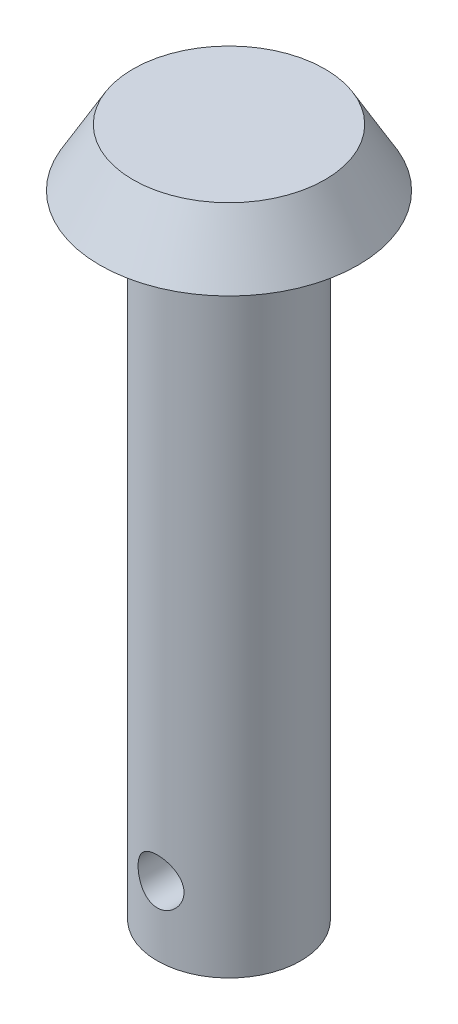
ISO-10303-21;
HEADER;
FILE_DESCRIPTION(('STEP AP214'),'2;1');
FILE_NAME('part.step','',(''),(''),'','','');
FILE_SCHEMA(('AUTOMOTIVE_DESIGN { 1 0 10303 214 1 1 1 1 }'));
ENDSEC;
DATA;
#1=APPLICATION_CONTEXT('core data for automotive mechanical design processes');
#2=APPLICATION_PROTOCOL_DEFINITION('international standard','automotive_design',2000,#1);
#3=PRODUCT_CONTEXT('',#1,'mechanical');
#4=PRODUCT('Part','Part','',(#3));
#5=PRODUCT_RELATED_PRODUCT_CATEGORY('part','',(#4));
#6=PRODUCT_DEFINITION_FORMATION('','',#4);
#7=PRODUCT_DEFINITION_CONTEXT('part definition',#1,'design');
#8=PRODUCT_DEFINITION('design','',#6,#7);
#9=PRODUCT_DEFINITION_SHAPE('','',#8);
#10=(LENGTH_UNIT() NAMED_UNIT(*) SI_UNIT(.MILLI.,.METRE.));
#11=(NAMED_UNIT(*) PLANE_ANGLE_UNIT() SI_UNIT($,.RADIAN.));
#12=(NAMED_UNIT(*) SI_UNIT($,.STERADIAN.) SOLID_ANGLE_UNIT());
#13=UNCERTAINTY_MEASURE_WITH_UNIT(LENGTH_MEASURE(1.E-05),#10,'distance_accuracy_value','');
#14=(GEOMETRIC_REPRESENTATION_CONTEXT(3) GLOBAL_UNCERTAINTY_ASSIGNED_CONTEXT((#13)) GLOBAL_UNIT_ASSIGNED_CONTEXT((#10,
#11,#12)) REPRESENTATION_CONTEXT('',''));
#15=CARTESIAN_POINT('',(0.,0.,0.));
#16=DIRECTION('',(0.,0.,1.));
#17=DIRECTION('',(1.,0.,0.));
#18=AXIS2_PLACEMENT_3D('',#15,#16,#17);
#19=CARTESIAN_POINT('',(0.,110.,0.));
#20=DIRECTION('',(0.,-1.,0.));
#21=DIRECTION('',(0.,0.,-1.));
#22=AXIS2_PLACEMENT_3D('',#19,#20,#21);
#23=CYLINDRICAL_SURFACE('',#22,12.5);
#24=CARTESIAN_POINT('',(0.,16.,-12.5));
#25=CARTESIAN_POINT('',(-0.218739515789951,15.9999993908735,-12.4999994635907));
#26=CARTESIAN_POINT('',(-0.437486592647655,15.9819985118019,-12.4942046039089));
#27=CARTESIAN_POINT('',(-0.868567253093709,15.9106704511769,-12.4716565543057));
#28=CARTESIAN_POINT('',(-1.08089965843427,15.8573368204552,-12.454901363839));
#29=CARTESIAN_POINT('',(-1.49287306447891,15.7173376969706,-12.4122595908852));
#30=CARTESIAN_POINT('',(-1.69253368346149,15.6307252690735,-12.3863875511298));
#31=CARTESIAN_POINT('',(-2.07449690712789,15.4268579247818,-12.3281725410718));
#32=CARTESIAN_POINT('',(-2.25679651756237,15.309597735586,-12.2958284575098));
#33=CARTESIAN_POINT('',(-2.60473689448745,15.0437897162399,-12.2269266983455));
#34=CARTESIAN_POINT('',(-2.76974023061599,14.8944322526164,-12.1902739433225));
#35=CARTESIAN_POINT('',(-3.07283559233071,14.5703923336315,-12.1174266425772));
#36=CARTESIAN_POINT('',(-3.21092229484498,14.3957048808629,-12.0812321888099));
#37=CARTESIAN_POINT('',(-3.45978487684573,14.0203678637239,-12.012370269974));
#38=CARTESIAN_POINT('',(-3.56975307774839,13.8191592968232,-11.9798196408788));
#39=CARTESIAN_POINT('',(-3.75402292836496,13.3998941405751,-11.9233664449728));
#40=CARTESIAN_POINT('',(-3.82833449433394,13.1818422550308,-11.8994614742253));
#41=CARTESIAN_POINT('',(-3.93682835778228,12.7422934818163,-11.8640030689908));
#42=CARTESIAN_POINT('',(-3.97219742115686,12.5211197456144,-11.8520853732299));
#43=CARTESIAN_POINT('',(-4.00551082647404,12.0756810020443,-11.8408707762137));
#44=CARTESIAN_POINT('',(-4.00346567735333,11.8514168803904,-11.8415703310132));
#45=CARTESIAN_POINT('',(-3.96293451839878,11.4160860377509,-11.8551904771854));
#46=CARTESIAN_POINT('',(-3.92597105327877,11.204858866299,-11.8676004346024));
#47=CARTESIAN_POINT('',(-3.81912647431514,10.7917778888601,-11.9024114349979));
#48=CARTESIAN_POINT('',(-3.74924170672462,10.5899251260173,-11.9248135869381));
#49=CARTESIAN_POINT('',(-3.57749112898224,10.197755352963,-11.9774663544073));
#50=CARTESIAN_POINT('',(-3.47515682759626,10.0076594501287,-12.0078307368189));
#51=CARTESIAN_POINT('',(-3.24173735834848,9.64684489242573,-12.0729361214443));
#52=CARTESIAN_POINT('',(-3.11064442067799,9.47613149313915,-12.1076783053403));
#53=CARTESIAN_POINT('',(-2.81601378851059,9.1503383178364,-12.1796593035711));
#54=CARTESIAN_POINT('',(-2.65122340623531,8.99639805765353,-12.216938020211));
#55=CARTESIAN_POINT('',(-2.29770358054263,8.71805330441531,-12.2883292028654));
#56=CARTESIAN_POINT('',(-2.10897218913167,8.59365121714261,-12.3224414108409));
#57=CARTESIAN_POINT('',(-1.710653951781,8.37709139179959,-12.3840447436164));
#58=CARTESIAN_POINT('',(-1.50090319860161,8.28521724790896,-12.411477013699));
#59=CARTESIAN_POINT('',(-1.06783962590281,8.13840100834319,-12.4562040275044));
#60=CARTESIAN_POINT('',(-0.844531157828865,8.0834471304582,-12.4735020051158));
#61=CARTESIAN_POINT('',(-0.4003544739733,8.01399983333697,-12.4954856059785));
#62=CARTESIAN_POINT('',(-0.179750715042686,7.99796481597225,-12.5006515044539));
#63=CARTESIAN_POINT('',(0.261025673970265,8.00244804555326,-12.4992163829611));
#64=CARTESIAN_POINT('',(0.481198365218599,8.0229606632747,-12.4926171751051));
#65=CARTESIAN_POINT('',(0.908837545509529,8.09872528270291,-12.4687095079374));
#66=CARTESIAN_POINT('',(1.11648590619506,8.15304977521476,-12.4516871662316));
#67=CARTESIAN_POINT('',(1.51965413650145,8.29375449849063,-12.4089396498837));
#68=CARTESIAN_POINT('',(1.71517248448531,8.38013874150544,-12.3832133859887));
#69=CARTESIAN_POINT('',(2.09399230967611,8.58492754294538,-12.3248882754976));
#70=CARTESIAN_POINT('',(2.27686405125242,8.70408127985576,-12.2921331567523));
#71=CARTESIAN_POINT('',(2.62052875751655,8.97013468246409,-12.223485206012));
#72=CARTESIAN_POINT('',(2.78131543888496,9.11704221614576,-12.187591485802));
#73=CARTESIAN_POINT('',(3.08320803721588,9.4416853990274,-12.1148241820809));
#74=CARTESIAN_POINT('',(3.22321448689051,9.6204506692212,-12.0779721041684));
#75=CARTESIAN_POINT('',(3.47135354981423,9.99973668614553,-12.0090110777536));
#76=CARTESIAN_POINT('',(3.57948642564104,10.2002572536351,-11.9769020901785));
#77=CARTESIAN_POINT('',(3.76018950753079,10.6171089466402,-11.9214065721644));
#78=CARTESIAN_POINT('',(3.83287665768614,10.8333853374742,-11.8979914205013));
#79=CARTESIAN_POINT('',(3.94051670615503,11.2760180245258,-11.8627820424832));
#80=CARTESIAN_POINT('',(3.97548487516417,11.50237020284,-11.8509831134183));
#81=CARTESIAN_POINT('',(4.00556338278915,11.94718992291,-11.8408481974692));
#82=CARTESIAN_POINT('',(4.00248471115016,12.1655225283225,-11.8419004772846));
#83=CARTESIAN_POINT('',(3.96095887873426,12.5983925135868,-11.8558539773436));
#84=CARTESIAN_POINT('',(3.92251352152803,12.8129300864026,-11.8687545933658));
#85=CARTESIAN_POINT('',(3.81258331041153,13.2287085634422,-11.9045135786104));
#86=CARTESIAN_POINT('',(3.74164069856766,13.4301079972322,-11.9272081809191));
#87=CARTESIAN_POINT('',(3.56916068710955,13.818304401002,-11.979949389859));
#88=CARTESIAN_POINT('',(3.46761685286564,14.0050982894068,-12.009997542498));
#89=CARTESIAN_POINT('',(3.2319816676858,14.367024074536,-12.0755873592094));
#90=CARTESIAN_POINT('',(3.09673271078946,14.5413706568351,-12.111302976317));
#91=CARTESIAN_POINT('',(2.79953499482211,14.8654793645524,-12.1834295211838));
#92=CARTESIAN_POINT('',(2.63757895417057,15.0152347629966,-12.2198406361674));
#93=CARTESIAN_POINT('',(2.28478052574588,15.2911457148096,-12.2907777050029));
#94=CARTESIAN_POINT('',(2.09312837940195,15.4162973797108,-12.3251937970096));
#95=CARTESIAN_POINT('',(1.69040882481734,15.6324504702431,-12.3868446924465));
#96=CARTESIAN_POINT('',(1.47934815802039,15.723463698302,-12.4140819767823));
#97=CARTESIAN_POINT('',(1.05915857911211,15.8631194495761,-12.4567085266016));
#98=CARTESIAN_POINT('',(0.85094191621833,15.9142961264578,-12.4727975325363));
#99=CARTESIAN_POINT('',(0.428485002690303,15.98273285726,-12.4944423385348));
#100=CARTESIAN_POINT('',(0.214246128153489,16.0000005966136,-12.5000005253903));
#101=CARTESIAN_POINT('',(0.,16.,-12.5));
#102=B_SPLINE_CURVE_WITH_KNOTS('',3,(#24,#25,#26,#27,#28,#29,#30,#31,#32,#33,#34,#35,#36,#37,
#38,#39,#40,#41,#42,#43,#44,#45,#46,#47,#48,#49,#50,#51,#52,#53,#54,#55,#56,#57,#58,#59,#60,#61,
#62,#63,#64,#65,#66,#67,#68,#69,#70,#71,#72,#73,#74,#75,#76,#77,#78,#79,#80,#81,#82,#83,#84,#85,
#86,#87,#88,#89,#90,#91,#92,#93,#94,#95,#96,#97,#98,#99,#100,#101),.UNSPECIFIED.,.T.,.F.,(4,2,2,
2,2,2,2,2,2,2,2,2,2,2,2,2,2,2,2,2,2,2,2,2,2,2,2,2,2,2,2,2,2,2,2,2,2,2,4),(0.,0.655430724666219,
1.31098111587091,1.96549050527928,2.62011257411757,3.29374295378917,3.96750641671064,
4.65887072066566,5.35004264179886,6.01951224998766,6.68879381985559,7.33017723381302,
7.97163184802041,8.62280489842004,9.27415409537618,9.95668212026653,10.6392657156648,
11.3276617834058,12.0158380617097,12.6762752648346,13.3366107533684,13.9795854097457,
14.6226405610093,15.281833876428,15.9412143491714,16.6280748263774,17.3149296449995,
17.9995027669286,18.6837986322708,19.3356533743721,19.9874748761256,20.6287955720838,
21.2702512150686,21.937843916949,22.6056189371905,23.2966571383324,23.9874562112942,
24.6295685076846,25.2715352530413),.UNSPECIFIED.);
#103=CARTESIAN_POINT('',(0.,16.,-12.5));
#104=VERTEX_POINT('',#103);
#105=EDGE_CURVE('E43',#104,#104,#102,.T.);
#106=ORIENTED_EDGE('',*,*,#105,.T.);
#107=EDGE_LOOP('',(#106));
#108=FACE_BOUND('',#107,.T.);
#109=CARTESIAN_POINT('',(4.,12.,11.842719282327));
#110=CARTESIAN_POINT('',(3.99999935935302,11.7815844050271,11.8427199699566));
#111=CARTESIAN_POINT('',(3.98204982916322,11.5631612406136,11.8488277399487));
#112=CARTESIAN_POINT('',(3.91094422931103,11.1327510309496,11.8724842974625));
#113=CARTESIAN_POINT('',(3.85777999166795,10.9207654908264,11.8900357393061));
#114=CARTESIAN_POINT('',(3.71827554706383,10.5095297458981,11.9343925365716));
#115=CARTESIAN_POINT('',(3.6319962541729,10.3102569367448,11.9611808918508));
#116=CARTESIAN_POINT('',(3.42891586136008,9.92895589744494,12.0209691387475));
#117=CARTESIAN_POINT('',(3.3121088807135,9.74693099907831,12.0539702268166));
#118=CARTESIAN_POINT('',(3.04678104882872,9.39873401217067,12.1237992191192));
#119=CARTESIAN_POINT('',(2.89734836823299,9.23327458631313,12.1607169507637));
#120=CARTESIAN_POINT('',(2.57296030582542,8.9292839353403,12.2334570053411));
#121=CARTESIAN_POINT('',(2.39800118371827,8.79075666344453,12.269279166812));
#122=CARTESIAN_POINT('',(2.02237355615693,8.54138653675002,12.3368238271391));
#123=CARTESIAN_POINT('',(1.82119171965248,8.43128212672686,12.3684282786178));
#124=CARTESIAN_POINT('',(1.40198048377137,8.24675359008593,12.4229242661366));
#125=CARTESIAN_POINT('',(1.18395526351672,8.1723206455933,12.4458179551613));
#126=CARTESIAN_POINT('',(0.744711775297695,8.06364055192911,12.479676950379));
#127=CARTESIAN_POINT('',(0.523823472185485,8.02817435584598,12.4910032748545));
#128=CARTESIAN_POINT('',(0.0789603248012304,7.99456723624724,12.5017287029849));
#129=CARTESIAN_POINT('',(-0.145013772077127,7.99641742799553,12.5011306457409));
#130=CARTESIAN_POINT('',(-0.581093729167384,8.03659875493092,12.4883236997896));
#131=CARTESIAN_POINT('',(-0.79333579075878,8.07360749460149,12.4765357034484));
#132=CARTESIAN_POINT('',(-1.20842073412411,8.18087955810293,12.4431948493389));
#133=CARTESIAN_POINT('',(-1.41126299248278,8.25114508414008,12.4216413449197));
#134=CARTESIAN_POINT('',(-1.80478487403707,8.4237580812943,12.3706365500491));
#135=CARTESIAN_POINT('',(-1.99527942968321,8.52649795398295,12.3410893332516));
#136=CARTESIAN_POINT('',(-2.35672859352838,8.76082551724733,12.2771970855205));
#137=CARTESIAN_POINT('',(-2.52767806251326,8.89242076868011,12.2428507979634));
#138=CARTESIAN_POINT('',(-2.8530638131067,9.18746910432926,12.1712367294856));
#139=CARTESIAN_POINT('',(-3.0064553444956,9.35206090762969,12.1339068619231));
#140=CARTESIAN_POINT('',(-3.28378018395939,9.7049706524631,12.0618145989439));
#141=CARTESIAN_POINT('',(-3.40770966195435,9.89329167394133,12.0270525377475));
#142=CARTESIAN_POINT('',(-3.62388810953954,10.2913918506909,11.9637089339779));
#143=CARTESIAN_POINT('',(-3.71573126088371,10.501405188261,11.9352081440021));
#144=CARTESIAN_POINT('',(-3.8624115437165,10.9350520157969,11.8885562852076));
#145=CARTESIAN_POINT('',(-3.91726274260851,11.1586802929226,11.8704012824717));
#146=CARTESIAN_POINT('',(-3.98634732980607,11.6031597752652,11.8473757948988));
#147=CARTESIAN_POINT('',(-4.0021876938619,11.8237341208218,11.8419801089925));
#148=CARTESIAN_POINT('',(-3.99732669767184,12.2644106763364,11.8436224693089));
#149=CARTESIAN_POINT('',(-3.97663132425953,12.484512957731,11.8506584784444));
#150=CARTESIAN_POINT('',(-3.90072533361949,12.9109425683618,11.8758511036107));
#151=CARTESIAN_POINT('',(-3.84659716428486,13.1174853667473,11.8936586123319));
#152=CARTESIAN_POINT('',(-3.70664280725108,13.5185278993496,11.9380128770361));
#153=CARTESIAN_POINT('',(-3.62081128645948,13.7130256009262,11.9645611032884));
#154=CARTESIAN_POINT('',(-3.41697396012587,14.0908696179046,12.0243860591649));
#155=CARTESIAN_POINT('',(-3.29808617389175,14.2737113970233,12.0578396098649));
#156=CARTESIAN_POINT('',(-3.03252999413197,14.6174335554594,12.1273479833206));
#157=CARTESIAN_POINT('',(-2.88585403708636,14.7783079350208,12.1634035126375));
#158=CARTESIAN_POINT('',(-2.56125244512296,15.0807977765855,12.2359628130699));
#159=CARTESIAN_POINT('',(-2.38223997872511,15.2212620039593,12.2724171226716));
#160=CARTESIAN_POINT('',(-2.00229721221567,15.4702126931918,12.3400966382304));
#161=CARTESIAN_POINT('',(-1.8013678483623,15.5787005203037,12.3713220674134));
#162=CARTESIAN_POINT('',(-1.38445940226065,15.7595899931693,12.4248572290492));
#163=CARTESIAN_POINT('',(-1.16859881389168,15.8322452960344,12.4472294035216));
#164=CARTESIAN_POINT('',(-0.726874957063008,15.9399602602768,12.480810616577));
#165=CARTESIAN_POINT('',(-0.501015012458269,15.9750323183173,12.4920233359687));
#166=CARTESIAN_POINT('',(-0.0562765879062646,16.0055392697494,12.5017663129826));
#167=CARTESIAN_POINT('',(0.162477761236095,16.0026332875747,12.5008274477244));
#168=CARTESIAN_POINT('',(0.596238594775696,15.9613072880544,12.4876568899275));
#169=CARTESIAN_POINT('',(0.81124534294192,15.9228897804991,12.4754259954572));
#170=CARTESIAN_POINT('',(1.22850760398064,15.8127043230851,12.4412233539435));
#171=CARTESIAN_POINT('',(1.4308971714329,15.7413990688859,12.4193869374855));
#172=CARTESIAN_POINT('',(1.82093134276042,15.5678834760693,12.3682230993078));
#173=CARTESIAN_POINT('',(2.00857335487159,15.4656677204134,12.3388943647058));
#174=CARTESIAN_POINT('',(2.37094464163666,15.2290972305365,12.2745138549376));
#175=CARTESIAN_POINT('',(2.54499113183174,15.093741909489,12.2392975634481));
#176=CARTESIAN_POINT('',(2.86844801950664,14.7964768103991,12.1675595998111));
#177=CARTESIAN_POINT('',(3.0178508446577,14.6345589007648,12.1310375306124));
#178=CARTESIAN_POINT('',(3.29310491309765,14.2819333859096,12.0592883124172));
#179=CARTESIAN_POINT('',(3.41794102245578,14.0904124948214,12.0241521106559));
#180=CARTESIAN_POINT('',(3.63353471705189,13.6880382358177,11.9607741956668));
#181=CARTESIAN_POINT('',(3.72430441468119,13.4771917723932,11.9325300332104));
#182=CARTESIAN_POINT('',(3.86354015966022,13.0575428972292,11.8881467072458));
#183=CARTESIAN_POINT('',(3.91455627646292,12.8496621102857,11.8712893448615));
#184=CARTESIAN_POINT('',(3.98278180434112,12.4278555029525,11.8485768271906));
#185=CARTESIAN_POINT('',(4.00000062749409,12.2139313823864,11.8427186088149));
#186=CARTESIAN_POINT('',(4.,12.,11.842719282327));
#187=B_SPLINE_CURVE_WITH_KNOTS('',3,(#109,#110,#111,#112,#113,#114,#115,#116,#117,#118,#119,
#120,#121,#122,#123,#124,#125,#126,#127,#128,#129,#130,#131,#132,#133,#134,#135,#136,#137,#138,
#139,#140,#141,#142,#143,#144,#145,#146,#147,#148,#149,#150,#151,#152,#153,#154,#155,#156,#157,
#158,#159,#160,#161,#162,#163,#164,#165,#166,#167,#168,#169,#170,#171,#172,#173,#174,#175,#176,
#177,#178,#179,#180,#181,#182,#183,#184,#185,#186),.UNSPECIFIED.,.T.,.F.,(4,2,2,2,2,2,2,2,2,2,2,
2,2,2,2,2,2,2,2,2,2,2,2,2,2,2,2,2,2,2,2,2,2,2,2,2,2,2,4),(0.,0.654455842715354,1.309063538331,
1.96247283098349,2.6160080865338,3.29090543042416,3.96590176403351,4.6569844372768,
5.34789618881212,6.01651686048925,6.68497834076492,7.32925318507043,7.9735706981002,
8.62599225189614,9.27858496176539,9.95962670810642,10.6407569418194,11.3302140454822,
12.0194088123988,12.6796997833962,13.3398825675735,13.979736408686,14.6196979341528,
15.2787163323882,15.9379143638459,16.6259668097989,17.3139898746478,17.9970699222358,
18.6799245895443,19.3330513205858,19.9861318951797,20.6302921470087,21.2745653528473,
21.9414122843778,22.6084637396799,23.2990150253329,23.9893205507533,24.6305185843684,
25.2715380278761),.UNSPECIFIED.);
#188=CARTESIAN_POINT('',(4.,12.,11.842719282327));
#189=VERTEX_POINT('',#188);
#190=EDGE_CURVE('E62',#189,#189,#187,.T.);
#191=ORIENTED_EDGE('',*,*,#190,.T.);
#192=EDGE_LOOP('',(#191));
#193=FACE_BOUND('',#192,.T.);
#194=CARTESIAN_POINT('',(0.,110.,0.));
#195=DIRECTION('',(0.,1.,0.));
#196=DIRECTION('',(0.,0.,1.));
#197=AXIS2_PLACEMENT_3D('',#194,#195,#196);
#198=CIRCLE('',#197,12.5);
#199=CARTESIAN_POINT('',(0.,110.,12.5));
#200=VERTEX_POINT('',#199);
#201=EDGE_CURVE('E10',#200,#200,#198,.T.);
#202=ORIENTED_EDGE('',*,*,#201,.F.);
#203=EDGE_LOOP('',(#202));
#204=FACE_BOUND('',#203,.T.);
#205=CARTESIAN_POINT('',(0.,0.,0.));
#206=DIRECTION('',(0.,1.,0.));
#207=DIRECTION('',(0.,0.,1.));
#208=AXIS2_PLACEMENT_3D('',#205,#206,#207);
#209=CIRCLE('',#208,12.5);
#210=CARTESIAN_POINT('',(0.,0.,12.5));
#211=VERTEX_POINT('',#210);
#212=EDGE_CURVE('E52',#211,#211,#209,.T.);
#213=ORIENTED_EDGE('',*,*,#212,.T.);
#214=EDGE_LOOP('',(#213));
#215=FACE_BOUND('',#214,.T.);
#216=ADVANCED_FACE('F39',(#108,#193,#204,#215),#23,.T.);
#217=CARTESIAN_POINT('',(0.,0.,0.));
#218=DIRECTION('',(0.,1.,0.));
#219=DIRECTION('',(0.,0.,1.));
#220=AXIS2_PLACEMENT_3D('',#217,#218,#219);
#221=PLANE('',#220);
#222=ORIENTED_EDGE('',*,*,#212,.F.);
#223=EDGE_LOOP('',(#222));
#224=FACE_BOUND('',#223,.T.);
#225=ADVANCED_FACE('F83',(#224),#221,.F.);
#226=CARTESIAN_POINT('',(0.,110.,0.));
#227=DIRECTION('',(0.,-1.,0.));
#228=DIRECTION('',(0.,0.,1.));
#229=AXIS2_PLACEMENT_3D('',#226,#227,#228);
#230=CONICAL_SURFACE('',#229,22.5,0.523598775598299);
#231=CARTESIAN_POINT('',(0.,120.,0.));
#232=DIRECTION('',(0.,1.,0.));
#233=DIRECTION('',(0.,0.,1.));
#234=AXIS2_PLACEMENT_3D('',#231,#232,#233);
#235=CIRCLE('',#234,16.7264973081037);
#236=CARTESIAN_POINT('',(0.,120.,16.7264973081037));
#237=VERTEX_POINT('',#236);
#238=EDGE_CURVE('E58',#237,#237,#235,.T.);
#239=ORIENTED_EDGE('',*,*,#238,.F.);
#240=EDGE_LOOP('',(#239));
#241=FACE_BOUND('',#240,.T.);
#242=CARTESIAN_POINT('',(0.,110.,0.));
#243=DIRECTION('',(0.,1.,0.));
#244=DIRECTION('',(0.,0.,1.));
#245=AXIS2_PLACEMENT_3D('',#242,#243,#244);
#246=CIRCLE('',#245,22.5);
#247=CARTESIAN_POINT('',(0.,110.,22.5));
#248=VERTEX_POINT('',#247);
#249=EDGE_CURVE('E102',#248,#248,#246,.T.);
#250=ORIENTED_EDGE('',*,*,#249,.T.);
#251=EDGE_LOOP('',(#250));
#252=FACE_BOUND('',#251,.T.);
#253=ADVANCED_FACE('F78',(#241,#252),#230,.T.);
#254=CARTESIAN_POINT('',(0.,120.,0.));
#255=DIRECTION('',(0.,1.,0.));
#256=DIRECTION('',(0.,0.,1.));
#257=AXIS2_PLACEMENT_3D('',#254,#255,#256);
#258=PLANE('',#257);
#259=ORIENTED_EDGE('',*,*,#238,.T.);
#260=EDGE_LOOP('',(#259));
#261=FACE_BOUND('',#260,.T.);
#262=ADVANCED_FACE('F74',(#261),#258,.T.);
#263=CARTESIAN_POINT('',(0.,110.,0.));
#264=DIRECTION('',(0.,1.,0.));
#265=DIRECTION('',(0.,0.,1.));
#266=AXIS2_PLACEMENT_3D('',#263,#264,#265);
#267=PLANE('',#266);
#268=ORIENTED_EDGE('',*,*,#201,.T.);
#269=EDGE_LOOP('',(#268));
#270=FACE_BOUND('',#269,.T.);
#271=ORIENTED_EDGE('',*,*,#249,.F.);
#272=EDGE_LOOP('',(#271));
#273=FACE_BOUND('',#272,.T.);
#274=ADVANCED_FACE('F72',(#270,#273),#267,.F.);
#275=CARTESIAN_POINT('',(0.,12.,-30.));
#276=DIRECTION('',(0.,0.,1.));
#277=DIRECTION('',(1.,0.,0.));
#278=AXIS2_PLACEMENT_3D('',#275,#276,#277);
#279=CYLINDRICAL_SURFACE('',#278,4.);
#280=ORIENTED_EDGE('',*,*,#190,.F.);
#281=EDGE_LOOP('',(#280));
#282=FACE_BOUND('',#281,.T.);
#283=ORIENTED_EDGE('',*,*,#105,.F.);
#284=EDGE_LOOP('',(#283));
#285=FACE_BOUND('',#284,.T.);
#286=ADVANCED_FACE('F68',(#282,#285),#279,.F.);
#287=CLOSED_SHELL('',(#216,#225,#253,#262,#274,#286));
#288=MANIFOLD_SOLID_BREP('B2',#287);
#289=ADVANCED_BREP_SHAPE_REPRESENTATION('',(#18,#288),#14);
#290=SHAPE_DEFINITION_REPRESENTATION(#9,#289);
ENDSEC;
END-ISO-10303-21;
